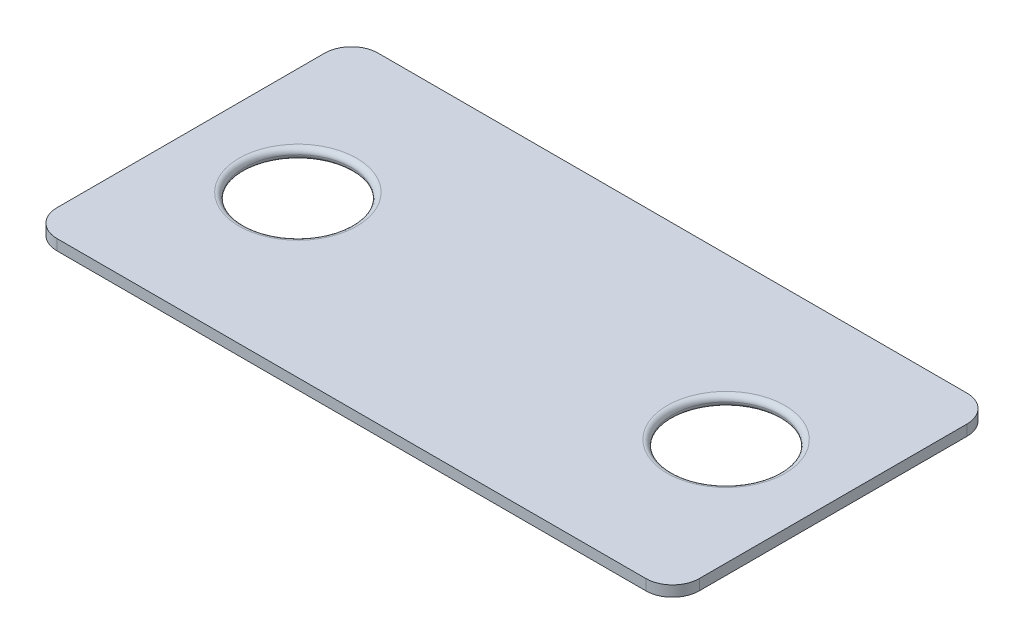
ISO-10303-21;
HEADER;
FILE_DESCRIPTION(('STEP AP214'),'2;1');
FILE_NAME('part.step','',(''),(''),'','','');
FILE_SCHEMA(('AUTOMOTIVE_DESIGN { 1 0 10303 214 1 1 1 1 }'));
ENDSEC;
DATA;
#1=APPLICATION_CONTEXT('core data for automotive mechanical design processes');
#2=APPLICATION_PROTOCOL_DEFINITION('international standard','automotive_design',2000,#1);
#3=PRODUCT_CONTEXT('',#1,'mechanical');
#4=PRODUCT('Part','Part','',(#3));
#5=PRODUCT_RELATED_PRODUCT_CATEGORY('part','',(#4));
#6=PRODUCT_DEFINITION_FORMATION('','',#4);
#7=PRODUCT_DEFINITION_CONTEXT('part definition',#1,'design');
#8=PRODUCT_DEFINITION('design','',#6,#7);
#9=PRODUCT_DEFINITION_SHAPE('','',#8);
#10=(LENGTH_UNIT() NAMED_UNIT(*) SI_UNIT(.MILLI.,.METRE.));
#11=(NAMED_UNIT(*) PLANE_ANGLE_UNIT() SI_UNIT($,.RADIAN.));
#12=(NAMED_UNIT(*) SI_UNIT($,.STERADIAN.) SOLID_ANGLE_UNIT());
#13=UNCERTAINTY_MEASURE_WITH_UNIT(LENGTH_MEASURE(1.E-05),#10,'distance_accuracy_value','');
#14=(GEOMETRIC_REPRESENTATION_CONTEXT(3) GLOBAL_UNCERTAINTY_ASSIGNED_CONTEXT((#13)) GLOBAL_UNIT_ASSIGNED_CONTEXT((#10,
#11,#12)) REPRESENTATION_CONTEXT('',''));
#15=CARTESIAN_POINT('',(0.,0.,0.));
#16=DIRECTION('',(0.,0.,1.));
#17=DIRECTION('',(1.,0.,0.));
#18=AXIS2_PLACEMENT_3D('',#15,#16,#17);
#19=CARTESIAN_POINT('',(-55.,-2.,25.));
#20=DIRECTION('',(0.,1.,0.));
#21=DIRECTION('',(0.,0.,1.));
#22=AXIS2_PLACEMENT_3D('',#19,#20,#21);
#23=CYLINDRICAL_SURFACE('',#22,5.);
#24=CARTESIAN_POINT('',(-55.,0.,25.));
#25=DIRECTION('',(0.,1.,0.));
#26=DIRECTION('',(0.,0.,-1.));
#27=AXIS2_PLACEMENT_3D('',#24,#25,#26);
#28=CIRCLE('',#27,5.);
#29=CARTESIAN_POINT('',(-60.,0.,25.));
#30=VERTEX_POINT('',#29);
#31=CARTESIAN_POINT('',(-55.,0.,30.));
#32=VERTEX_POINT('',#31);
#33=EDGE_CURVE('E141',#30,#32,#28,.T.);
#34=ORIENTED_EDGE('',*,*,#33,.F.);
#35=DIRECTION('',(0.,1.,0.));
#36=VECTOR('',#35,1.);
#37=CARTESIAN_POINT('',(-60.,-2.,25.));
#38=LINE('',#37,#36);
#39=CARTESIAN_POINT('',(-60.,-2.,25.));
#40=VERTEX_POINT('',#39);
#41=EDGE_CURVE('E58',#40,#30,#38,.T.);
#42=ORIENTED_EDGE('',*,*,#41,.F.);
#43=CARTESIAN_POINT('',(-55.,-2.,25.));
#44=DIRECTION('',(0.,1.,0.));
#45=DIRECTION('',(0.,0.,-1.));
#46=AXIS2_PLACEMENT_3D('',#43,#44,#45);
#47=CIRCLE('',#46,5.);
#48=CARTESIAN_POINT('',(-55.,-2.,30.));
#49=VERTEX_POINT('',#48);
#50=EDGE_CURVE('E162',#40,#49,#47,.T.);
#51=ORIENTED_EDGE('',*,*,#50,.T.);
#52=DIRECTION('',(0.,1.,0.));
#53=VECTOR('',#52,1.);
#54=CARTESIAN_POINT('',(-55.,-2.,30.));
#55=LINE('',#54,#53);
#56=EDGE_CURVE('E99',#49,#32,#55,.T.);
#57=ORIENTED_EDGE('',*,*,#56,.T.);
#58=EDGE_LOOP('',(#34,#42,#51,#57));
#59=FACE_BOUND('',#58,.T.);
#60=ADVANCED_FACE('F41',(#59),#23,.T.);
#61=CARTESIAN_POINT('',(-60.,-2.,25.));
#62=DIRECTION('',(-1.,0.,0.));
#63=DIRECTION('',(0.,0.,1.));
#64=AXIS2_PLACEMENT_3D('',#61,#62,#63);
#65=PLANE('',#64);
#66=DIRECTION('',(0.,0.,1.));
#67=VECTOR('',#66,1.);
#68=CARTESIAN_POINT('',(-60.,0.,25.));
#69=LINE('',#68,#67);
#70=CARTESIAN_POINT('',(-60.,0.,-25.));
#71=VERTEX_POINT('',#70);
#72=EDGE_CURVE('E159',#71,#30,#69,.T.);
#73=ORIENTED_EDGE('',*,*,#72,.F.);
#74=DIRECTION('',(0.,1.,0.));
#75=VECTOR('',#74,1.);
#76=CARTESIAN_POINT('',(-60.,-2.,-25.));
#77=LINE('',#76,#75);
#78=CARTESIAN_POINT('',(-60.,-2.,-25.));
#79=VERTEX_POINT('',#78);
#80=EDGE_CURVE('E87',#79,#71,#77,.T.);
#81=ORIENTED_EDGE('',*,*,#80,.F.);
#82=DIRECTION('',(0.,0.,1.));
#83=VECTOR('',#82,1.);
#84=CARTESIAN_POINT('',(-60.,-2.,25.));
#85=LINE('',#84,#83);
#86=EDGE_CURVE('E131',#79,#40,#85,.T.);
#87=ORIENTED_EDGE('',*,*,#86,.T.);
#88=ORIENTED_EDGE('',*,*,#41,.T.);
#89=EDGE_LOOP('',(#73,#81,#87,#88));
#90=FACE_BOUND('',#89,.T.);
#91=ADVANCED_FACE('F201',(#90),#65,.T.);
#92=CARTESIAN_POINT('',(-55.,-2.,-25.));
#93=DIRECTION('',(0.,1.,0.));
#94=DIRECTION('',(0.,0.,1.));
#95=AXIS2_PLACEMENT_3D('',#92,#93,#94);
#96=CYLINDRICAL_SURFACE('',#95,5.);
#97=CARTESIAN_POINT('',(-55.,0.,-25.));
#98=DIRECTION('',(0.,1.,0.));
#99=DIRECTION('',(0.,0.,1.));
#100=AXIS2_PLACEMENT_3D('',#97,#98,#99);
#101=CIRCLE('',#100,5.);
#102=CARTESIAN_POINT('',(-55.,0.,-30.));
#103=VERTEX_POINT('',#102);
#104=EDGE_CURVE('E118',#103,#71,#101,.T.);
#105=ORIENTED_EDGE('',*,*,#104,.F.);
#106=DIRECTION('',(0.,1.,0.));
#107=VECTOR('',#106,1.);
#108=CARTESIAN_POINT('',(-55.,-2.,-30.));
#109=LINE('',#108,#107);
#110=CARTESIAN_POINT('',(-55.,-2.,-30.));
#111=VERTEX_POINT('',#110);
#112=EDGE_CURVE('E113',#111,#103,#109,.T.);
#113=ORIENTED_EDGE('',*,*,#112,.F.);
#114=CARTESIAN_POINT('',(-55.,-2.,-25.));
#115=DIRECTION('',(0.,1.,0.));
#116=DIRECTION('',(0.,0.,1.));
#117=AXIS2_PLACEMENT_3D('',#114,#115,#116);
#118=CIRCLE('',#117,5.);
#119=EDGE_CURVE('E116',#111,#79,#118,.T.);
#120=ORIENTED_EDGE('',*,*,#119,.T.);
#121=ORIENTED_EDGE('',*,*,#80,.T.);
#122=EDGE_LOOP('',(#105,#113,#120,#121));
#123=FACE_BOUND('',#122,.T.);
#124=ADVANCED_FACE('F115',(#123),#96,.T.);
#125=CARTESIAN_POINT('',(55.,-2.,-30.));
#126=DIRECTION('',(0.,0.,-1.));
#127=DIRECTION('',(-1.,0.,0.));
#128=AXIS2_PLACEMENT_3D('',#125,#126,#127);
#129=PLANE('',#128);
#130=DIRECTION('',(-1.,0.,0.));
#131=VECTOR('',#130,1.);
#132=CARTESIAN_POINT('',(55.,0.,-30.));
#133=LINE('',#132,#131);
#134=CARTESIAN_POINT('',(55.,0.,-30.));
#135=VERTEX_POINT('',#134);
#136=EDGE_CURVE('E156',#135,#103,#133,.T.);
#137=ORIENTED_EDGE('',*,*,#136,.F.);
#138=DIRECTION('',(0.,1.,0.));
#139=VECTOR('',#138,1.);
#140=CARTESIAN_POINT('',(55.,-2.,-30.));
#141=LINE('',#140,#139);
#142=CARTESIAN_POINT('',(55.,-2.,-30.));
#143=VERTEX_POINT('',#142);
#144=EDGE_CURVE('E123',#143,#135,#141,.T.);
#145=ORIENTED_EDGE('',*,*,#144,.F.);
#146=DIRECTION('',(-1.,0.,0.));
#147=VECTOR('',#146,1.);
#148=CARTESIAN_POINT('',(55.,-2.,-30.));
#149=LINE('',#148,#147);
#150=EDGE_CURVE('E129',#143,#111,#149,.T.);
#151=ORIENTED_EDGE('',*,*,#150,.T.);
#152=ORIENTED_EDGE('',*,*,#112,.T.);
#153=EDGE_LOOP('',(#137,#145,#151,#152));
#154=FACE_BOUND('',#153,.T.);
#155=ADVANCED_FACE('F133',(#154),#129,.T.);
#156=CARTESIAN_POINT('',(55.,-2.,-25.));
#157=DIRECTION('',(0.,1.,0.));
#158=DIRECTION('',(0.,0.,1.));
#159=AXIS2_PLACEMENT_3D('',#156,#157,#158);
#160=CYLINDRICAL_SURFACE('',#159,5.);
#161=CARTESIAN_POINT('',(55.,0.,-25.));
#162=DIRECTION('',(0.,1.,0.));
#163=DIRECTION('',(0.,0.,1.));
#164=AXIS2_PLACEMENT_3D('',#161,#162,#163);
#165=CIRCLE('',#164,5.);
#166=CARTESIAN_POINT('',(60.,0.,-25.));
#167=VERTEX_POINT('',#166);
#168=EDGE_CURVE('E153',#167,#135,#165,.T.);
#169=ORIENTED_EDGE('',*,*,#168,.F.);
#170=DIRECTION('',(0.,1.,0.));
#171=VECTOR('',#170,1.);
#172=CARTESIAN_POINT('',(60.,-2.,-25.));
#173=LINE('',#172,#171);
#174=CARTESIAN_POINT('',(60.,-2.,-25.));
#175=VERTEX_POINT('',#174);
#176=EDGE_CURVE('E167',#175,#167,#173,.T.);
#177=ORIENTED_EDGE('',*,*,#176,.F.);
#178=CARTESIAN_POINT('',(55.,-2.,-25.));
#179=DIRECTION('',(0.,1.,0.));
#180=DIRECTION('',(0.,0.,1.));
#181=AXIS2_PLACEMENT_3D('',#178,#179,#180);
#182=CIRCLE('',#181,5.);
#183=EDGE_CURVE('E134',#175,#143,#182,.T.);
#184=ORIENTED_EDGE('',*,*,#183,.T.);
#185=ORIENTED_EDGE('',*,*,#144,.T.);
#186=EDGE_LOOP('',(#169,#177,#184,#185));
#187=FACE_BOUND('',#186,.T.);
#188=ADVANCED_FACE('F236',(#187),#160,.T.);
#189=CARTESIAN_POINT('',(60.,-2.,25.));
#190=DIRECTION('',(1.,0.,0.));
#191=DIRECTION('',(0.,0.,-1.));
#192=AXIS2_PLACEMENT_3D('',#189,#190,#191);
#193=PLANE('',#192);
#194=DIRECTION('',(0.,0.,-1.));
#195=VECTOR('',#194,1.);
#196=CARTESIAN_POINT('',(60.,0.,25.));
#197=LINE('',#196,#195);
#198=CARTESIAN_POINT('',(60.,0.,25.));
#199=VERTEX_POINT('',#198);
#200=EDGE_CURVE('E150',#199,#167,#197,.T.);
#201=ORIENTED_EDGE('',*,*,#200,.F.);
#202=DIRECTION('',(0.,1.,0.));
#203=VECTOR('',#202,1.);
#204=CARTESIAN_POINT('',(60.,-2.,25.));
#205=LINE('',#204,#203);
#206=CARTESIAN_POINT('',(60.,-2.,25.));
#207=VERTEX_POINT('',#206);
#208=EDGE_CURVE('E169',#207,#199,#205,.T.);
#209=ORIENTED_EDGE('',*,*,#208,.F.);
#210=DIRECTION('',(0.,0.,-1.));
#211=VECTOR('',#210,1.);
#212=CARTESIAN_POINT('',(60.,-2.,25.));
#213=LINE('',#212,#211);
#214=EDGE_CURVE('E136',#207,#175,#213,.T.);
#215=ORIENTED_EDGE('',*,*,#214,.T.);
#216=ORIENTED_EDGE('',*,*,#176,.T.);
#217=EDGE_LOOP('',(#201,#209,#215,#216));
#218=FACE_BOUND('',#217,.T.);
#219=ADVANCED_FACE('F239',(#218),#193,.T.);
#220=CARTESIAN_POINT('',(55.,-2.,25.));
#221=DIRECTION('',(0.,1.,0.));
#222=DIRECTION('',(0.,0.,1.));
#223=AXIS2_PLACEMENT_3D('',#220,#221,#222);
#224=CYLINDRICAL_SURFACE('',#223,5.);
#225=CARTESIAN_POINT('',(55.,0.,25.));
#226=DIRECTION('',(0.,1.,0.));
#227=DIRECTION('',(0.,0.,1.));
#228=AXIS2_PLACEMENT_3D('',#225,#226,#227);
#229=CIRCLE('',#228,5.);
#230=CARTESIAN_POINT('',(55.,0.,30.));
#231=VERTEX_POINT('',#230);
#232=EDGE_CURVE('E147',#231,#199,#229,.T.);
#233=ORIENTED_EDGE('',*,*,#232,.F.);
#234=DIRECTION('',(0.,1.,0.));
#235=VECTOR('',#234,1.);
#236=CARTESIAN_POINT('',(55.,-2.,30.));
#237=LINE('',#236,#235);
#238=CARTESIAN_POINT('',(55.,-2.,30.));
#239=VERTEX_POINT('',#238);
#240=EDGE_CURVE('E171',#239,#231,#237,.T.);
#241=ORIENTED_EDGE('',*,*,#240,.F.);
#242=CARTESIAN_POINT('',(55.,-2.,25.));
#243=DIRECTION('',(0.,1.,0.));
#244=DIRECTION('',(0.,0.,1.));
#245=AXIS2_PLACEMENT_3D('',#242,#243,#244);
#246=CIRCLE('',#245,5.);
#247=EDGE_CURVE('E253',#239,#207,#246,.T.);
#248=ORIENTED_EDGE('',*,*,#247,.T.);
#249=ORIENTED_EDGE('',*,*,#208,.T.);
#250=EDGE_LOOP('',(#233,#241,#248,#249));
#251=FACE_BOUND('',#250,.T.);
#252=ADVANCED_FACE('F230',(#251),#224,.T.);
#253=CARTESIAN_POINT('',(55.,-2.,30.));
#254=DIRECTION('',(0.,0.,1.));
#255=DIRECTION('',(1.,0.,0.));
#256=AXIS2_PLACEMENT_3D('',#253,#254,#255);
#257=PLANE('',#256);
#258=DIRECTION('',(1.,0.,0.));
#259=VECTOR('',#258,1.);
#260=CARTESIAN_POINT('',(55.,0.,30.));
#261=LINE('',#260,#259);
#262=EDGE_CURVE('E144',#32,#231,#261,.T.);
#263=ORIENTED_EDGE('',*,*,#262,.F.);
#264=ORIENTED_EDGE('',*,*,#56,.F.);
#265=DIRECTION('',(1.,0.,0.));
#266=VECTOR('',#265,1.);
#267=CARTESIAN_POINT('',(55.,-2.,30.));
#268=LINE('',#267,#266);
#269=EDGE_CURVE('E252',#49,#239,#268,.T.);
#270=ORIENTED_EDGE('',*,*,#269,.T.);
#271=ORIENTED_EDGE('',*,*,#240,.T.);
#272=EDGE_LOOP('',(#263,#264,#270,#271));
#273=FACE_BOUND('',#272,.T.);
#274=ADVANCED_FACE('F209',(#273),#257,.T.);
#275=CARTESIAN_POINT('',(-55.,-2.,25.));
#276=DIRECTION('',(0.,-1.,0.));
#277=DIRECTION('',(0.,0.,-1.));
#278=AXIS2_PLACEMENT_3D('',#275,#276,#277);
#279=PLANE('',#278);
#280=CARTESIAN_POINT('',(40.,-2.,0.));
#281=DIRECTION('',(0.,-1.,0.));
#282=DIRECTION('',(0.,0.,-1.));
#283=AXIS2_PLACEMENT_3D('',#280,#281,#282);
#284=CIRCLE('',#283,11.);
#285=CARTESIAN_POINT('',(40.,-2.,-11.));
#286=VERTEX_POINT('',#285);
#287=EDGE_CURVE('E12',#286,#286,#284,.F.);
#288=ORIENTED_EDGE('',*,*,#287,.T.);
#289=EDGE_LOOP('',(#288));
#290=FACE_BOUND('',#289,.T.);
#291=CARTESIAN_POINT('',(-40.,-2.,0.));
#292=DIRECTION('',(0.,-1.,0.));
#293=DIRECTION('',(0.,0.,-1.));
#294=AXIS2_PLACEMENT_3D('',#291,#292,#293);
#295=CIRCLE('',#294,11.);
#296=CARTESIAN_POINT('',(-40.,-2.,-11.));
#297=VERTEX_POINT('',#296);
#298=EDGE_CURVE('E50',#297,#297,#295,.F.);
#299=ORIENTED_EDGE('',*,*,#298,.T.);
#300=EDGE_LOOP('',(#299));
#301=FACE_BOUND('',#300,.T.);
#302=ORIENTED_EDGE('',*,*,#50,.F.);
#303=ORIENTED_EDGE('',*,*,#86,.F.);
#304=ORIENTED_EDGE('',*,*,#119,.F.);
#305=ORIENTED_EDGE('',*,*,#150,.F.);
#306=ORIENTED_EDGE('',*,*,#183,.F.);
#307=ORIENTED_EDGE('',*,*,#214,.F.);
#308=ORIENTED_EDGE('',*,*,#247,.F.);
#309=ORIENTED_EDGE('',*,*,#269,.F.);
#310=EDGE_LOOP('',(#302,#303,#304,#305,#306,#307,#308,#309));
#311=FACE_BOUND('',#310,.T.);
#312=ADVANCED_FACE('F127',(#290,#301,#311),#279,.T.);
#313=CARTESIAN_POINT('',(-55.,0.,25.));
#314=DIRECTION('',(0.,-1.,0.));
#315=DIRECTION('',(0.,0.,-1.));
#316=AXIS2_PLACEMENT_3D('',#313,#314,#315);
#317=PLANE('',#316);
#318=CARTESIAN_POINT('',(40.,0.,0.));
#319=DIRECTION('',(0.,-1.,0.));
#320=DIRECTION('',(0.,0.,-1.));
#321=AXIS2_PLACEMENT_3D('',#318,#319,#320);
#322=CIRCLE('',#321,11.);
#323=CARTESIAN_POINT('',(40.,0.,-11.));
#324=VERTEX_POINT('',#323);
#325=EDGE_CURVE('E179',#324,#324,#322,.T.);
#326=ORIENTED_EDGE('',*,*,#325,.T.);
#327=EDGE_LOOP('',(#326));
#328=FACE_BOUND('',#327,.T.);
#329=CARTESIAN_POINT('',(-40.,0.,0.));
#330=DIRECTION('',(0.,-1.,0.));
#331=DIRECTION('',(0.,0.,-1.));
#332=AXIS2_PLACEMENT_3D('',#329,#330,#331);
#333=CIRCLE('',#332,11.);
#334=CARTESIAN_POINT('',(-40.,0.,-11.));
#335=VERTEX_POINT('',#334);
#336=EDGE_CURVE('E176',#335,#335,#333,.T.);
#337=ORIENTED_EDGE('',*,*,#336,.T.);
#338=EDGE_LOOP('',(#337));
#339=FACE_BOUND('',#338,.T.);
#340=ORIENTED_EDGE('',*,*,#33,.T.);
#341=ORIENTED_EDGE('',*,*,#262,.T.);
#342=ORIENTED_EDGE('',*,*,#232,.T.);
#343=ORIENTED_EDGE('',*,*,#200,.T.);
#344=ORIENTED_EDGE('',*,*,#168,.T.);
#345=ORIENTED_EDGE('',*,*,#136,.T.);
#346=ORIENTED_EDGE('',*,*,#104,.T.);
#347=ORIENTED_EDGE('',*,*,#72,.T.);
#348=EDGE_LOOP('',(#340,#341,#342,#343,#344,#345,#346,#347));
#349=FACE_BOUND('',#348,.T.);
#350=ADVANCED_FACE('F212',(#328,#339,#349),#317,.F.);
#351=CARTESIAN_POINT('',(40.,-1.,0.));
#352=DIRECTION('',(0.,-1.,0.));
#353=DIRECTION('',(0.,0.,-1.));
#354=AXIS2_PLACEMENT_3D('',#351,#352,#353);
#355=TOROIDAL_SURFACE('',#354,11.,1.);
#356=ORIENTED_EDGE('',*,*,#325,.F.);
#357=EDGE_LOOP('',(#356));
#358=FACE_BOUND('',#357,.T.);
#359=CARTESIAN_POINT('',(40.,-1.,0.));
#360=DIRECTION('',(0.,-1.,0.));
#361=DIRECTION('',(0.,0.,-1.));
#362=AXIS2_PLACEMENT_3D('',#359,#360,#361);
#363=CIRCLE('',#362,10.);
#364=CARTESIAN_POINT('',(40.,-1.,-10.));
#365=VERTEX_POINT('',#364);
#366=EDGE_CURVE('E164',#365,#365,#363,.F.);
#367=ORIENTED_EDGE('',*,*,#366,.F.);
#368=EDGE_LOOP('',(#367));
#369=FACE_BOUND('',#368,.T.);
#370=ADVANCED_FACE('F197',(#358,#369),#355,.T.);
#371=CARTESIAN_POINT('',(-40.,-1.,0.));
#372=DIRECTION('',(0.,-1.,0.));
#373=DIRECTION('',(0.,0.,-1.));
#374=AXIS2_PLACEMENT_3D('',#371,#372,#373);
#375=TOROIDAL_SURFACE('',#374,11.,1.);
#376=ORIENTED_EDGE('',*,*,#336,.F.);
#377=EDGE_LOOP('',(#376));
#378=FACE_BOUND('',#377,.T.);
#379=CARTESIAN_POINT('',(-40.,-1.,0.));
#380=DIRECTION('',(0.,-1.,0.));
#381=DIRECTION('',(0.,0.,-1.));
#382=AXIS2_PLACEMENT_3D('',#379,#380,#381);
#383=CIRCLE('',#382,10.);
#384=CARTESIAN_POINT('',(-40.,-1.,-10.));
#385=VERTEX_POINT('',#384);
#386=EDGE_CURVE('E182',#385,#385,#383,.F.);
#387=ORIENTED_EDGE('',*,*,#386,.F.);
#388=EDGE_LOOP('',(#387));
#389=FACE_BOUND('',#388,.T.);
#390=ADVANCED_FACE('F190',(#378,#389),#375,.T.);
#391=CARTESIAN_POINT('',(-40.,-1.,0.));
#392=DIRECTION('',(0.,-1.,0.));
#393=DIRECTION('',(0.,0.,-1.));
#394=AXIS2_PLACEMENT_3D('',#391,#392,#393);
#395=TOROIDAL_SURFACE('',#394,11.,1.);
#396=ORIENTED_EDGE('',*,*,#386,.T.);
#397=EDGE_LOOP('',(#396));
#398=FACE_BOUND('',#397,.T.);
#399=ORIENTED_EDGE('',*,*,#298,.F.);
#400=EDGE_LOOP('',(#399));
#401=FACE_BOUND('',#400,.T.);
#402=ADVANCED_FACE('F188',(#398,#401),#395,.T.);
#403=CARTESIAN_POINT('',(40.,-1.,0.));
#404=DIRECTION('',(0.,-1.,0.));
#405=DIRECTION('',(0.,0.,-1.));
#406=AXIS2_PLACEMENT_3D('',#403,#404,#405);
#407=TOROIDAL_SURFACE('',#406,11.,1.);
#408=ORIENTED_EDGE('',*,*,#366,.T.);
#409=EDGE_LOOP('',(#408));
#410=FACE_BOUND('',#409,.T.);
#411=ORIENTED_EDGE('',*,*,#287,.F.);
#412=EDGE_LOOP('',(#411));
#413=FACE_BOUND('',#412,.T.);
#414=ADVANCED_FACE('F43',(#410,#413),#407,.T.);
#415=CLOSED_SHELL('',(#60,#91,#124,#155,#188,#219,#252,#274,#312,#350,#370,#390,#402,#414));
#416=MANIFOLD_SOLID_BREP('B2',#415);
#417=ADVANCED_BREP_SHAPE_REPRESENTATION('',(#18,#416),#14);
#418=SHAPE_DEFINITION_REPRESENTATION(#9,#417);
ENDSEC;
END-ISO-10303-21;
